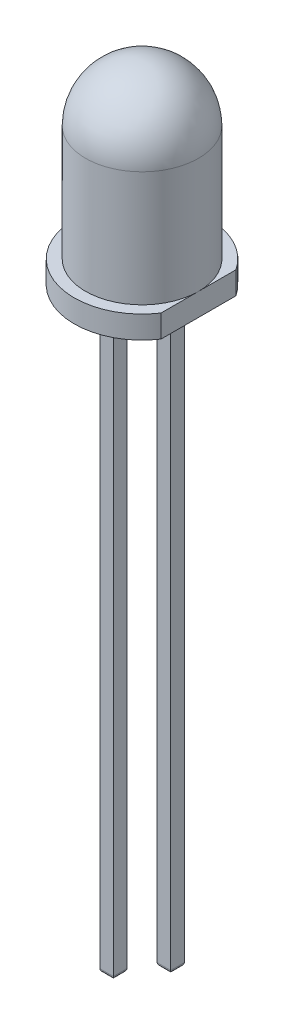
ISO-10303-21;
HEADER;
FILE_DESCRIPTION(('STEP AP214'),'2;1');
FILE_NAME('part.step','',(''),(''),'','','');
FILE_SCHEMA(('AUTOMOTIVE_DESIGN { 1 0 10303 214 1 1 1 1 }'));
ENDSEC;
DATA;
#1=APPLICATION_CONTEXT('core data for automotive mechanical design processes');
#2=APPLICATION_PROTOCOL_DEFINITION('international standard','automotive_design',2000,#1);
#3=PRODUCT_CONTEXT('',#1,'mechanical');
#4=PRODUCT('Part','Part','',(#3));
#5=PRODUCT_RELATED_PRODUCT_CATEGORY('part','',(#4));
#6=PRODUCT_DEFINITION_FORMATION('','',#4);
#7=PRODUCT_DEFINITION_CONTEXT('part definition',#1,'design');
#8=PRODUCT_DEFINITION('design','',#6,#7);
#9=PRODUCT_DEFINITION_SHAPE('','',#8);
#10=(LENGTH_UNIT() NAMED_UNIT(*) SI_UNIT(.MILLI.,.METRE.));
#11=(NAMED_UNIT(*) PLANE_ANGLE_UNIT() SI_UNIT($,.RADIAN.));
#12=(NAMED_UNIT(*) SI_UNIT($,.STERADIAN.) SOLID_ANGLE_UNIT());
#13=UNCERTAINTY_MEASURE_WITH_UNIT(LENGTH_MEASURE(1.E-05),#10,'distance_accuracy_value','');
#14=(GEOMETRIC_REPRESENTATION_CONTEXT(3) GLOBAL_UNCERTAINTY_ASSIGNED_CONTEXT((#13)) GLOBAL_UNIT_ASSIGNED_CONTEXT((#10,
#11,#12)) REPRESENTATION_CONTEXT('',''));
#15=CARTESIAN_POINT('',(0.,0.,0.));
#16=DIRECTION('',(0.,0.,1.));
#17=DIRECTION('',(1.,0.,0.));
#18=AXIS2_PLACEMENT_3D('',#15,#16,#17);
#19=CARTESIAN_POINT('',(0.,-4.3,0.));
#20=DIRECTION('',(0.,1.,0.));
#21=DIRECTION('',(0.,0.,1.));
#22=AXIS2_PLACEMENT_3D('',#19,#20,#21);
#23=PLANE('',#22);
#24=DIRECTION('',(0.,0.,-1.));
#25=VECTOR('',#24,1.);
#26=CARTESIAN_POINT('',(1.72,-4.3,0.));
#27=LINE('',#26,#25);
#28=CARTESIAN_POINT('',(1.72,-4.3,0.45));
#29=VERTEX_POINT('',#28);
#30=CARTESIAN_POINT('',(1.72,-4.3,-0.45));
#31=VERTEX_POINT('',#30);
#32=EDGE_CURVE('E235',#29,#31,#27,.T.);
#33=ORIENTED_EDGE('',*,*,#32,.T.);
#34=DIRECTION('',(1.,0.,0.));
#35=VECTOR('',#34,1.);
#36=CARTESIAN_POINT('',(0.97,-4.3,-0.45));
#37=LINE('',#36,#35);
#38=CARTESIAN_POINT('',(0.82,-4.3,-0.45));
#39=VERTEX_POINT('',#38);
#40=EDGE_CURVE('E237',#31,#39,#37,.F.);
#41=ORIENTED_EDGE('',*,*,#40,.T.);
#42=DIRECTION('',(0.,0.,-1.));
#43=VECTOR('',#42,1.);
#44=CARTESIAN_POINT('',(0.82,-4.3,0.3));
#45=LINE('',#44,#43);
#46=CARTESIAN_POINT('',(0.82,-4.3,0.45));
#47=VERTEX_POINT('',#46);
#48=EDGE_CURVE('E233',#39,#47,#45,.F.);
#49=ORIENTED_EDGE('',*,*,#48,.T.);
#50=DIRECTION('',(1.,0.,0.));
#51=VECTOR('',#50,1.);
#52=CARTESIAN_POINT('',(0.,-4.3,0.45));
#53=LINE('',#52,#51);
#54=EDGE_CURVE('E231',#47,#29,#53,.T.);
#55=ORIENTED_EDGE('',*,*,#54,.T.);
#56=EDGE_LOOP('',(#33,#41,#49,#55));
#57=FACE_BOUND('',#56,.T.);
#58=DIRECTION('',(-1.,0.,0.));
#59=VECTOR('',#58,1.);
#60=CARTESIAN_POINT('',(0.,-4.3,-0.45));
#61=LINE('',#60,#59);
#62=CARTESIAN_POINT('',(-0.82,-4.3,-0.45));
#63=VERTEX_POINT('',#62);
#64=CARTESIAN_POINT('',(-1.72,-4.3,-0.45));
#65=VERTEX_POINT('',#64);
#66=EDGE_CURVE('E198',#63,#65,#61,.T.);
#67=ORIENTED_EDGE('',*,*,#66,.T.);
#68=DIRECTION('',(0.,0.,1.));
#69=VECTOR('',#68,1.);
#70=CARTESIAN_POINT('',(-1.72,-4.3,0.));
#71=LINE('',#70,#69);
#72=CARTESIAN_POINT('',(-1.72,-4.3,0.45));
#73=VERTEX_POINT('',#72);
#74=EDGE_CURVE('E200',#65,#73,#71,.T.);
#75=ORIENTED_EDGE('',*,*,#74,.T.);
#76=DIRECTION('',(-1.,0.,0.));
#77=VECTOR('',#76,1.);
#78=CARTESIAN_POINT('',(-0.97,-4.3,0.45));
#79=LINE('',#78,#77);
#80=CARTESIAN_POINT('',(-0.82,-4.3,0.45));
#81=VERTEX_POINT('',#80);
#82=EDGE_CURVE('E194',#73,#81,#79,.F.);
#83=ORIENTED_EDGE('',*,*,#82,.T.);
#84=DIRECTION('',(0.,0.,1.));
#85=VECTOR('',#84,1.);
#86=CARTESIAN_POINT('',(-0.82,-4.3,-0.3));
#87=LINE('',#86,#85);
#88=EDGE_CURVE('E196',#81,#63,#87,.F.);
#89=ORIENTED_EDGE('',*,*,#88,.T.);
#90=EDGE_LOOP('',(#67,#75,#83,#89));
#91=FACE_BOUND('',#90,.T.);
#92=CARTESIAN_POINT('',(0.,-4.3,0.));
#93=DIRECTION('',(0.,-1.,0.));
#94=DIRECTION('',(0.,0.,-1.));
#95=AXIS2_PLACEMENT_3D('',#92,#93,#94);
#96=CIRCLE('',#95,3.);
#97=CARTESIAN_POINT('',(2.5,-4.3,1.6583123951777));
#98=VERTEX_POINT('',#97);
#99=CARTESIAN_POINT('',(2.5,-4.3,-1.6583123951777));
#100=VERTEX_POINT('',#99);
#101=EDGE_CURVE('E171',#98,#100,#96,.T.);
#102=ORIENTED_EDGE('',*,*,#101,.T.);
#103=DIRECTION('',(0.,0.,1.));
#104=VECTOR('',#103,1.);
#105=CARTESIAN_POINT('',(2.5,-4.3,0.));
#106=LINE('',#105,#104);
#107=EDGE_CURVE('E166',#100,#98,#106,.T.);
#108=ORIENTED_EDGE('',*,*,#107,.T.);
#109=EDGE_LOOP('',(#102,#108));
#110=FACE_BOUND('',#109,.T.);
#111=ADVANCED_FACE('F32',(#57,#91,#110),#23,.F.);
#112=CARTESIAN_POINT('',(0.,4.3,0.));
#113=DIRECTION('',(0.,-1.,0.));
#114=DIRECTION('',(0.,0.,-1.));
#115=AXIS2_PLACEMENT_3D('',#112,#113,#114);
#116=CYLINDRICAL_SURFACE('',#115,2.5);
#117=CARTESIAN_POINT('',(0.,1.8,0.));
#118=DIRECTION('',(0.,-1.,0.));
#119=DIRECTION('',(0.,0.,-1.));
#120=AXIS2_PLACEMENT_3D('',#117,#118,#119);
#121=CIRCLE('',#120,2.5);
#122=CARTESIAN_POINT('',(0.,1.8,-2.5));
#123=VERTEX_POINT('',#122);
#124=EDGE_CURVE('E186',#123,#123,#121,.T.);
#125=ORIENTED_EDGE('',*,*,#124,.T.);
#126=EDGE_LOOP('',(#125));
#127=FACE_BOUND('',#126,.T.);
#128=CARTESIAN_POINT('',(0.,-3.3,0.));
#129=DIRECTION('',(0.,-1.,0.));
#130=DIRECTION('',(0.,0.,-1.));
#131=AXIS2_PLACEMENT_3D('',#128,#129,#130);
#132=CIRCLE('',#131,2.5);
#133=CARTESIAN_POINT('',(2.5,-3.3,0.));
#134=VERTEX_POINT('',#133);
#135=EDGE_CURVE('E180',#134,#134,#132,.T.);
#136=ORIENTED_EDGE('',*,*,#135,.F.);
#137=EDGE_LOOP('',(#136));
#138=FACE_BOUND('',#137,.T.);
#139=ADVANCED_FACE('F349',(#127,#138),#116,.T.);
#140=CARTESIAN_POINT('',(0.,-3.3,0.));
#141=DIRECTION('',(0.,-1.,0.));
#142=DIRECTION('',(0.,0.,-1.));
#143=AXIS2_PLACEMENT_3D('',#140,#141,#142);
#144=PLANE('',#143);
#145=CARTESIAN_POINT('',(0.,-3.3,0.));
#146=DIRECTION('',(0.,-1.,0.));
#147=DIRECTION('',(0.,0.,-1.));
#148=AXIS2_PLACEMENT_3D('',#145,#146,#147);
#149=CIRCLE('',#148,3.);
#150=CARTESIAN_POINT('',(2.5,-3.3,1.6583123951777));
#151=VERTEX_POINT('',#150);
#152=CARTESIAN_POINT('',(2.5,-3.3,-1.6583123951777));
#153=VERTEX_POINT('',#152);
#154=EDGE_CURVE('E178',#151,#153,#149,.T.);
#155=ORIENTED_EDGE('',*,*,#154,.F.);
#156=DIRECTION('',(0.,0.,1.));
#157=VECTOR('',#156,1.);
#158=CARTESIAN_POINT('',(2.5,-3.3,-3.));
#159=LINE('',#158,#157);
#160=EDGE_CURVE('E181',#134,#151,#159,.T.);
#161=ORIENTED_EDGE('',*,*,#160,.F.);
#162=ORIENTED_EDGE('',*,*,#135,.T.);
#163=EDGE_CURVE('E163',#153,#134,#159,.T.);
#164=ORIENTED_EDGE('',*,*,#163,.F.);
#165=EDGE_LOOP('',(#155,#161,#162,#164));
#166=FACE_BOUND('',#165,.T.);
#167=ADVANCED_FACE('F177',(#166),#144,.F.);
#168=CARTESIAN_POINT('',(0.,-3.3,0.));
#169=DIRECTION('',(0.,-1.,0.));
#170=DIRECTION('',(0.,0.,-1.));
#171=AXIS2_PLACEMENT_3D('',#168,#169,#170);
#172=CYLINDRICAL_SURFACE('',#171,3.);
#173=DIRECTION('',(0.,-1.,0.));
#174=VECTOR('',#173,1.);
#175=CARTESIAN_POINT('',(2.5,-3.3,-1.6583123951777));
#176=LINE('',#175,#174);
#177=EDGE_CURVE('E160',#100,#153,#176,.F.);
#178=ORIENTED_EDGE('',*,*,#177,.F.);
#179=ORIENTED_EDGE('',*,*,#101,.F.);
#180=DIRECTION('',(0.,-1.,0.));
#181=VECTOR('',#180,1.);
#182=CARTESIAN_POINT('',(2.5,-3.3,1.6583123951777));
#183=LINE('',#182,#181);
#184=EDGE_CURVE('E172',#151,#98,#183,.T.);
#185=ORIENTED_EDGE('',*,*,#184,.F.);
#186=ORIENTED_EDGE('',*,*,#154,.T.);
#187=EDGE_LOOP('',(#178,#179,#185,#186));
#188=FACE_BOUND('',#187,.T.);
#189=ADVANCED_FACE('F184',(#188),#172,.T.);
#190=CARTESIAN_POINT('',(0.,1.8,0.));
#191=DIRECTION('',(0.,0.,1.));
#192=DIRECTION('',(1.,0.,0.));
#193=AXIS2_PLACEMENT_3D('',#190,#191,#192);
#194=SPHERICAL_SURFACE('',#193,2.5);
#195=CARTESIAN_POINT('',(0.,1.8,0.));
#196=DIRECTION('',(0.,-1.,0.));
#197=DIRECTION('',(0.,0.,-1.));
#198=AXIS2_PLACEMENT_3D('',#195,#196,#197);
#199=SPHERICAL_SURFACE('',#198,2.5);
#200=ORIENTED_EDGE('',*,*,#124,.F.);
#201=EDGE_LOOP('',(#200));
#202=FACE_BOUND('',#201,.T.);
#203=ADVANCED_FACE('F361',(#202),#199,.T.);
#204=CARTESIAN_POINT('',(2.5,-3.3,-3.));
#205=DIRECTION('',(-1.,0.,0.));
#206=DIRECTION('',(0.,0.,1.));
#207=AXIS2_PLACEMENT_3D('',#204,#205,#206);
#208=PLANE('',#207);
#209=ORIENTED_EDGE('',*,*,#177,.T.);
#210=ORIENTED_EDGE('',*,*,#163,.T.);
#211=ORIENTED_EDGE('',*,*,#160,.T.);
#212=ORIENTED_EDGE('',*,*,#184,.T.);
#213=ORIENTED_EDGE('',*,*,#107,.F.);
#214=EDGE_LOOP('',(#209,#210,#211,#212,#213));
#215=FACE_BOUND('',#214,.T.);
#216=ADVANCED_FACE('F162',(#215),#208,.F.);
#217=CARTESIAN_POINT('',(-0.97,-31.3,-0.3));
#218=DIRECTION('',(0.,0.,-1.));
#219=DIRECTION('',(-1.,0.,0.));
#220=AXIS2_PLACEMENT_3D('',#217,#218,#219);
#221=PLANE('',#220);
#222=DIRECTION('',(0.,1.,0.));
#223=VECTOR('',#222,1.);
#224=CARTESIAN_POINT('',(-0.97,-31.3,-0.3));
#225=LINE('',#224,#223);
#226=CARTESIAN_POINT('',(-0.97,-31.15,-0.3));
#227=VERTEX_POINT('',#226);
#228=CARTESIAN_POINT('',(-0.97,-4.45,-0.3));
#229=VERTEX_POINT('',#228);
#230=EDGE_CURVE('E341',#227,#229,#225,.T.);
#231=ORIENTED_EDGE('',*,*,#230,.F.);
#232=DIRECTION('',(-1.,0.,0.));
#233=VECTOR('',#232,1.);
#234=CARTESIAN_POINT('',(-1.57,-31.15,-0.3));
#235=LINE('',#234,#233);
#236=CARTESIAN_POINT('',(-1.57,-31.15,-0.3));
#237=VERTEX_POINT('',#236);
#238=EDGE_CURVE('E276',#227,#237,#235,.T.);
#239=ORIENTED_EDGE('',*,*,#238,.T.);
#240=DIRECTION('',(0.,1.,0.));
#241=VECTOR('',#240,1.);
#242=CARTESIAN_POINT('',(-1.57,-31.3,-0.3));
#243=LINE('',#242,#241);
#244=CARTESIAN_POINT('',(-1.57,-4.45,-0.3));
#245=VERTEX_POINT('',#244);
#246=EDGE_CURVE('E340',#237,#245,#243,.T.);
#247=ORIENTED_EDGE('',*,*,#246,.T.);
#248=DIRECTION('',(-1.,0.,0.));
#249=VECTOR('',#248,1.);
#250=CARTESIAN_POINT('',(-0.97,-4.45,-0.3));
#251=LINE('',#250,#249);
#252=EDGE_CURVE('E206',#245,#229,#251,.F.);
#253=ORIENTED_EDGE('',*,*,#252,.T.);
#254=EDGE_LOOP('',(#231,#239,#247,#253));
#255=FACE_BOUND('',#254,.T.);
#256=ADVANCED_FACE('F536',(#255),#221,.T.);
#257=CARTESIAN_POINT('',(-0.97,-31.3,-0.3));
#258=DIRECTION('',(-1.,0.,0.));
#259=DIRECTION('',(0.,0.,1.));
#260=AXIS2_PLACEMENT_3D('',#257,#258,#259);
#261=PLANE('',#260);
#262=DIRECTION('',(0.,1.,0.));
#263=VECTOR('',#262,1.);
#264=CARTESIAN_POINT('',(-0.97,-31.3,0.3));
#265=LINE('',#264,#263);
#266=CARTESIAN_POINT('',(-0.97,-31.15,0.3));
#267=VERTEX_POINT('',#266);
#268=CARTESIAN_POINT('',(-0.97,-4.45,0.3));
#269=VERTEX_POINT('',#268);
#270=EDGE_CURVE('E343',#267,#269,#265,.T.);
#271=ORIENTED_EDGE('',*,*,#270,.F.);
#272=DIRECTION('',(0.,0.,1.));
#273=VECTOR('',#272,1.);
#274=CARTESIAN_POINT('',(-0.97,-31.15,-0.3));
#275=LINE('',#274,#273);
#276=EDGE_CURVE('E274',#267,#227,#275,.F.);
#277=ORIENTED_EDGE('',*,*,#276,.T.);
#278=ORIENTED_EDGE('',*,*,#230,.T.);
#279=DIRECTION('',(0.,0.,1.));
#280=VECTOR('',#279,1.);
#281=CARTESIAN_POINT('',(-0.97,-4.45,0.3));
#282=LINE('',#281,#280);
#283=EDGE_CURVE('E209',#229,#269,#282,.T.);
#284=ORIENTED_EDGE('',*,*,#283,.T.);
#285=EDGE_LOOP('',(#271,#277,#278,#284));
#286=FACE_BOUND('',#285,.T.);
#287=ADVANCED_FACE('F528',(#286),#261,.F.);
#288=CARTESIAN_POINT('',(-0.97,-31.3,0.3));
#289=DIRECTION('',(0.,0.,-1.));
#290=DIRECTION('',(-1.,0.,0.));
#291=AXIS2_PLACEMENT_3D('',#288,#289,#290);
#292=PLANE('',#291);
#293=DIRECTION('',(0.,1.,0.));
#294=VECTOR('',#293,1.);
#295=CARTESIAN_POINT('',(-1.57,-31.3,0.3));
#296=LINE('',#295,#294);
#297=CARTESIAN_POINT('',(-1.57,-31.15,0.3));
#298=VERTEX_POINT('',#297);
#299=CARTESIAN_POINT('',(-1.57,-4.45,0.3));
#300=VERTEX_POINT('',#299);
#301=EDGE_CURVE('E345',#298,#300,#296,.T.);
#302=ORIENTED_EDGE('',*,*,#301,.F.);
#303=DIRECTION('',(-1.,0.,0.));
#304=VECTOR('',#303,1.);
#305=CARTESIAN_POINT('',(-0.97,-31.15,0.3));
#306=LINE('',#305,#304);
#307=EDGE_CURVE('E272',#298,#267,#306,.F.);
#308=ORIENTED_EDGE('',*,*,#307,.T.);
#309=ORIENTED_EDGE('',*,*,#270,.T.);
#310=DIRECTION('',(-1.,0.,0.));
#311=VECTOR('',#310,1.);
#312=CARTESIAN_POINT('',(-1.57,-4.45,0.3));
#313=LINE('',#312,#311);
#314=EDGE_CURVE('E212',#269,#300,#313,.T.);
#315=ORIENTED_EDGE('',*,*,#314,.T.);
#316=EDGE_LOOP('',(#302,#308,#309,#315));
#317=FACE_BOUND('',#316,.T.);
#318=ADVANCED_FACE('F520',(#317),#292,.F.);
#319=CARTESIAN_POINT('',(-1.57,-31.3,-0.3));
#320=DIRECTION('',(-1.,0.,0.));
#321=DIRECTION('',(0.,0.,1.));
#322=AXIS2_PLACEMENT_3D('',#319,#320,#321);
#323=PLANE('',#322);
#324=ORIENTED_EDGE('',*,*,#246,.F.);
#325=DIRECTION('',(0.,0.,1.));
#326=VECTOR('',#325,1.);
#327=CARTESIAN_POINT('',(-1.57,-31.15,0.3));
#328=LINE('',#327,#326);
#329=EDGE_CURVE('E249',#237,#298,#328,.T.);
#330=ORIENTED_EDGE('',*,*,#329,.T.);
#331=ORIENTED_EDGE('',*,*,#301,.T.);
#332=DIRECTION('',(0.,0.,1.));
#333=VECTOR('',#332,1.);
#334=CARTESIAN_POINT('',(-1.57,-4.45,-0.3));
#335=LINE('',#334,#333);
#336=EDGE_CURVE('E203',#300,#245,#335,.F.);
#337=ORIENTED_EDGE('',*,*,#336,.T.);
#338=EDGE_LOOP('',(#324,#330,#331,#337));
#339=FACE_BOUND('',#338,.T.);
#340=ADVANCED_FACE('F512',(#339),#323,.T.);
#341=CARTESIAN_POINT('',(0.,-31.3,0.));
#342=DIRECTION('',(0.,1.,0.));
#343=DIRECTION('',(0.,0.,1.));
#344=AXIS2_PLACEMENT_3D('',#341,#342,#343);
#345=PLANE('',#344);
#346=DIRECTION('',(-1.,0.,0.));
#347=VECTOR('',#346,1.);
#348=CARTESIAN_POINT('',(0.,-31.3,0.15));
#349=LINE('',#348,#347);
#350=CARTESIAN_POINT('',(-1.12,-31.3,0.15));
#351=VERTEX_POINT('',#350);
#352=CARTESIAN_POINT('',(-1.42,-31.3,0.15));
#353=VERTEX_POINT('',#352);
#354=EDGE_CURVE('E267',#351,#353,#349,.T.);
#355=ORIENTED_EDGE('',*,*,#354,.T.);
#356=DIRECTION('',(0.,0.,1.));
#357=VECTOR('',#356,1.);
#358=CARTESIAN_POINT('',(-1.42,-31.3,-0.3));
#359=LINE('',#358,#357);
#360=CARTESIAN_POINT('',(-1.42,-31.3,-0.15));
#361=VERTEX_POINT('',#360);
#362=EDGE_CURVE('E269',#353,#361,#359,.F.);
#363=ORIENTED_EDGE('',*,*,#362,.T.);
#364=DIRECTION('',(-1.,0.,0.));
#365=VECTOR('',#364,1.);
#366=CARTESIAN_POINT('',(-0.97,-31.3,-0.15));
#367=LINE('',#366,#365);
#368=CARTESIAN_POINT('',(-1.12,-31.3,-0.15));
#369=VERTEX_POINT('',#368);
#370=EDGE_CURVE('E263',#361,#369,#367,.F.);
#371=ORIENTED_EDGE('',*,*,#370,.T.);
#372=DIRECTION('',(0.,0.,1.));
#373=VECTOR('',#372,1.);
#374=CARTESIAN_POINT('',(-1.12,-31.3,0.));
#375=LINE('',#374,#373);
#376=EDGE_CURVE('E265',#369,#351,#375,.T.);
#377=ORIENTED_EDGE('',*,*,#376,.T.);
#378=EDGE_LOOP('',(#355,#363,#371,#377));
#379=FACE_BOUND('',#378,.T.);
#380=ADVANCED_FACE('F505',(#379),#345,.F.);
#381=CARTESIAN_POINT('',(0.97,-29.8,0.3));
#382=DIRECTION('',(1.,0.,0.));
#383=DIRECTION('',(0.,0.,-1.));
#384=AXIS2_PLACEMENT_3D('',#381,#382,#383);
#385=PLANE('',#384);
#386=DIRECTION('',(0.,1.,0.));
#387=VECTOR('',#386,1.);
#388=CARTESIAN_POINT('',(0.97,-29.8,-0.3));
#389=LINE('',#388,#387);
#390=CARTESIAN_POINT('',(0.97,-29.65,-0.3));
#391=VERTEX_POINT('',#390);
#392=CARTESIAN_POINT('',(0.97,-4.45,-0.3));
#393=VERTEX_POINT('',#392);
#394=EDGE_CURVE('E335',#391,#393,#389,.T.);
#395=ORIENTED_EDGE('',*,*,#394,.F.);
#396=DIRECTION('',(0.,0.,-1.));
#397=VECTOR('',#396,1.);
#398=CARTESIAN_POINT('',(0.97,-29.65,0.3));
#399=LINE('',#398,#397);
#400=CARTESIAN_POINT('',(0.97,-29.65,0.3));
#401=VERTEX_POINT('',#400);
#402=EDGE_CURVE('E11',#391,#401,#399,.F.);
#403=ORIENTED_EDGE('',*,*,#402,.T.);
#404=DIRECTION('',(0.,1.,0.));
#405=VECTOR('',#404,1.);
#406=CARTESIAN_POINT('',(0.97,-29.8,0.3));
#407=LINE('',#406,#405);
#408=CARTESIAN_POINT('',(0.97,-4.45,0.3));
#409=VERTEX_POINT('',#408);
#410=EDGE_CURVE('E228',#401,#409,#407,.T.);
#411=ORIENTED_EDGE('',*,*,#410,.T.);
#412=DIRECTION('',(0.,0.,-1.));
#413=VECTOR('',#412,1.);
#414=CARTESIAN_POINT('',(0.97,-4.45,-0.3));
#415=LINE('',#414,#413);
#416=EDGE_CURVE('E243',#409,#393,#415,.T.);
#417=ORIENTED_EDGE('',*,*,#416,.T.);
#418=EDGE_LOOP('',(#395,#403,#411,#417));
#419=FACE_BOUND('',#418,.T.);
#420=ADVANCED_FACE('F499',(#419),#385,.F.);
#421=CARTESIAN_POINT('',(0.97,-29.8,-0.3));
#422=DIRECTION('',(0.,0.,1.));
#423=DIRECTION('',(1.,0.,0.));
#424=AXIS2_PLACEMENT_3D('',#421,#422,#423);
#425=PLANE('',#424);
#426=DIRECTION('',(0.,1.,0.));
#427=VECTOR('',#426,1.);
#428=CARTESIAN_POINT('',(1.57,-29.8,-0.3));
#429=LINE('',#428,#427);
#430=CARTESIAN_POINT('',(1.57,-29.65,-0.3));
#431=VERTEX_POINT('',#430);
#432=CARTESIAN_POINT('',(1.57,-4.45,-0.3));
#433=VERTEX_POINT('',#432);
#434=EDGE_CURVE('E333',#431,#433,#429,.T.);
#435=ORIENTED_EDGE('',*,*,#434,.F.);
#436=DIRECTION('',(1.,0.,0.));
#437=VECTOR('',#436,1.);
#438=CARTESIAN_POINT('',(0.97,-29.65,-0.3));
#439=LINE('',#438,#437);
#440=EDGE_CURVE('E41',#431,#391,#439,.F.);
#441=ORIENTED_EDGE('',*,*,#440,.T.);
#442=ORIENTED_EDGE('',*,*,#394,.T.);
#443=DIRECTION('',(1.,0.,0.));
#444=VECTOR('',#443,1.);
#445=CARTESIAN_POINT('',(1.57,-4.45,-0.3));
#446=LINE('',#445,#444);
#447=EDGE_CURVE('E215',#393,#433,#446,.T.);
#448=ORIENTED_EDGE('',*,*,#447,.T.);
#449=EDGE_LOOP('',(#435,#441,#442,#448));
#450=FACE_BOUND('',#449,.T.);
#451=ADVANCED_FACE('F492',(#450),#425,.F.);
#452=CARTESIAN_POINT('',(1.57,-29.8,0.3));
#453=DIRECTION('',(1.,0.,0.));
#454=DIRECTION('',(0.,0.,-1.));
#455=AXIS2_PLACEMENT_3D('',#452,#453,#454);
#456=PLANE('',#455);
#457=DIRECTION('',(0.,1.,0.));
#458=VECTOR('',#457,1.);
#459=CARTESIAN_POINT('',(1.57,-29.8,0.3));
#460=LINE('',#459,#458);
#461=CARTESIAN_POINT('',(1.57,-29.65,0.3));
#462=VERTEX_POINT('',#461);
#463=CARTESIAN_POINT('',(1.57,-4.45,0.3));
#464=VERTEX_POINT('',#463);
#465=EDGE_CURVE('E329',#462,#464,#460,.T.);
#466=ORIENTED_EDGE('',*,*,#465,.F.);
#467=DIRECTION('',(0.,0.,-1.));
#468=VECTOR('',#467,1.);
#469=CARTESIAN_POINT('',(1.57,-29.65,0.3));
#470=LINE('',#469,#468);
#471=EDGE_CURVE('E56',#462,#431,#470,.T.);
#472=ORIENTED_EDGE('',*,*,#471,.T.);
#473=ORIENTED_EDGE('',*,*,#434,.T.);
#474=DIRECTION('',(0.,0.,-1.));
#475=VECTOR('',#474,1.);
#476=CARTESIAN_POINT('',(1.57,-4.45,0.3));
#477=LINE('',#476,#475);
#478=EDGE_CURVE('E240',#433,#464,#477,.F.);
#479=ORIENTED_EDGE('',*,*,#478,.T.);
#480=EDGE_LOOP('',(#466,#472,#473,#479));
#481=FACE_BOUND('',#480,.T.);
#482=ADVANCED_FACE('F330',(#481),#456,.T.);
#483=CARTESIAN_POINT('',(0.97,-29.8,0.3));
#484=DIRECTION('',(0.,0.,1.));
#485=DIRECTION('',(1.,0.,0.));
#486=AXIS2_PLACEMENT_3D('',#483,#484,#485);
#487=PLANE('',#486);
#488=ORIENTED_EDGE('',*,*,#410,.F.);
#489=DIRECTION('',(1.,0.,0.));
#490=VECTOR('',#489,1.);
#491=CARTESIAN_POINT('',(0.97,-29.65,0.3));
#492=LINE('',#491,#490);
#493=EDGE_CURVE('E278',#401,#462,#492,.T.);
#494=ORIENTED_EDGE('',*,*,#493,.T.);
#495=ORIENTED_EDGE('',*,*,#465,.T.);
#496=DIRECTION('',(1.,0.,0.));
#497=VECTOR('',#496,1.);
#498=CARTESIAN_POINT('',(0.97,-4.45,0.3));
#499=LINE('',#498,#497);
#500=EDGE_CURVE('E246',#464,#409,#499,.F.);
#501=ORIENTED_EDGE('',*,*,#500,.T.);
#502=EDGE_LOOP('',(#488,#494,#495,#501));
#503=FACE_BOUND('',#502,.T.);
#504=ADVANCED_FACE('F328',(#503),#487,.T.);
#505=CARTESIAN_POINT('',(0.,-29.8,0.));
#506=DIRECTION('',(0.,-1.,0.));
#507=DIRECTION('',(0.,0.,-1.));
#508=AXIS2_PLACEMENT_3D('',#505,#506,#507);
#509=PLANE('',#508);
#510=DIRECTION('',(0.,0.,-1.));
#511=VECTOR('',#510,1.);
#512=CARTESIAN_POINT('',(1.42,-29.8,0.));
#513=LINE('',#512,#511);
#514=CARTESIAN_POINT('',(1.42,-29.8,-0.15));
#515=VERTEX_POINT('',#514);
#516=CARTESIAN_POINT('',(1.42,-29.8,0.15));
#517=VERTEX_POINT('',#516);
#518=EDGE_CURVE('E294',#515,#517,#513,.F.);
#519=ORIENTED_EDGE('',*,*,#518,.T.);
#520=DIRECTION('',(1.,0.,0.));
#521=VECTOR('',#520,1.);
#522=CARTESIAN_POINT('',(0.,-29.8,0.15));
#523=LINE('',#522,#521);
#524=CARTESIAN_POINT('',(1.12,-29.8,0.15));
#525=VERTEX_POINT('',#524);
#526=EDGE_CURVE('E296',#517,#525,#523,.F.);
#527=ORIENTED_EDGE('',*,*,#526,.T.);
#528=DIRECTION('',(0.,0.,-1.));
#529=VECTOR('',#528,1.);
#530=CARTESIAN_POINT('',(1.12,-29.8,-0.3));
#531=LINE('',#530,#529);
#532=CARTESIAN_POINT('',(1.12,-29.8,-0.15));
#533=VERTEX_POINT('',#532);
#534=EDGE_CURVE('E290',#525,#533,#531,.T.);
#535=ORIENTED_EDGE('',*,*,#534,.T.);
#536=DIRECTION('',(1.,0.,0.));
#537=VECTOR('',#536,1.);
#538=CARTESIAN_POINT('',(1.57,-29.8,-0.15));
#539=LINE('',#538,#537);
#540=EDGE_CURVE('E292',#533,#515,#539,.T.);
#541=ORIENTED_EDGE('',*,*,#540,.T.);
#542=EDGE_LOOP('',(#519,#527,#535,#541));
#543=FACE_BOUND('',#542,.T.);
#544=ADVANCED_FACE('F319',(#543),#509,.T.);
#545=CARTESIAN_POINT('',(-0.82,-4.45,-0.3));
#546=DIRECTION('',(0.,0.,-1.));
#547=DIRECTION('',(-1.,0.,0.));
#548=AXIS2_PLACEMENT_3D('',#545,#546,#547);
#549=CYLINDRICAL_SURFACE('',#548,0.15);
#550=CARTESIAN_POINT('',(-0.82,-4.45,0.45));
#551=DIRECTION('',(0.707106781186548,0.,-0.707106781186547));
#552=DIRECTION('',(0.707106781186547,0.,0.707106781186548));
#553=AXIS2_PLACEMENT_3D('',#550,#551,#552);
#554=ELLIPSE('',#553,0.212132034355964,0.15);
#555=EDGE_CURVE('E222',#269,#81,#554,.T.);
#556=ORIENTED_EDGE('',*,*,#555,.F.);
#557=ORIENTED_EDGE('',*,*,#283,.F.);
#558=CARTESIAN_POINT('',(-0.82,-4.45,-0.45));
#559=DIRECTION('',(-0.707106781186547,0.,-0.707106781186548));
#560=DIRECTION('',(0.707106781186548,0.,-0.707106781186547));
#561=AXIS2_PLACEMENT_3D('',#558,#559,#560);
#562=ELLIPSE('',#561,0.212132034355964,0.15);
#563=EDGE_CURVE('E225',#63,#229,#562,.F.);
#564=ORIENTED_EDGE('',*,*,#563,.F.);
#565=ORIENTED_EDGE('',*,*,#88,.F.);
#566=EDGE_LOOP('',(#556,#557,#564,#565));
#567=FACE_BOUND('',#566,.T.);
#568=ADVANCED_FACE('F377',(#567),#549,.F.);
#569=CARTESIAN_POINT('',(0.,-4.45,-0.45));
#570=DIRECTION('',(-1.,0.,0.));
#571=DIRECTION('',(0.,0.,1.));
#572=AXIS2_PLACEMENT_3D('',#569,#570,#571);
#573=CYLINDRICAL_SURFACE('',#572,0.15);
#574=ORIENTED_EDGE('',*,*,#563,.T.);
#575=ORIENTED_EDGE('',*,*,#252,.F.);
#576=CARTESIAN_POINT('',(-1.72,-4.45,-0.45));
#577=DIRECTION('',(-0.707106781186548,0.,0.707106781186547));
#578=DIRECTION('',(-0.707106781186547,0.,-0.707106781186548));
#579=AXIS2_PLACEMENT_3D('',#576,#577,#578);
#580=ELLIPSE('',#579,0.212132034355964,0.15);
#581=EDGE_CURVE('E218',#65,#245,#580,.F.);
#582=ORIENTED_EDGE('',*,*,#581,.F.);
#583=ORIENTED_EDGE('',*,*,#66,.F.);
#584=EDGE_LOOP('',(#574,#575,#582,#583));
#585=FACE_BOUND('',#584,.T.);
#586=ADVANCED_FACE('F373',(#585),#573,.F.);
#587=CARTESIAN_POINT('',(-0.97,-4.45,0.45));
#588=DIRECTION('',(1.,0.,0.));
#589=DIRECTION('',(0.,0.,-1.));
#590=AXIS2_PLACEMENT_3D('',#587,#588,#589);
#591=CYLINDRICAL_SURFACE('',#590,0.15);
#592=ORIENTED_EDGE('',*,*,#555,.T.);
#593=ORIENTED_EDGE('',*,*,#82,.F.);
#594=CARTESIAN_POINT('',(-1.72,-4.45,0.45));
#595=DIRECTION('',(0.707106781186547,0.,0.707106781186548));
#596=DIRECTION('',(0.707106781186548,0.,-0.707106781186547));
#597=AXIS2_PLACEMENT_3D('',#594,#595,#596);
#598=ELLIPSE('',#597,0.212132034355964,0.15);
#599=EDGE_CURVE('E216',#300,#73,#598,.T.);
#600=ORIENTED_EDGE('',*,*,#599,.F.);
#601=ORIENTED_EDGE('',*,*,#314,.F.);
#602=EDGE_LOOP('',(#592,#593,#600,#601));
#603=FACE_BOUND('',#602,.T.);
#604=ADVANCED_FACE('F369',(#603),#591,.F.);
#605=CARTESIAN_POINT('',(-1.72,-4.45,0.));
#606=DIRECTION('',(0.,0.,1.));
#607=DIRECTION('',(1.,0.,0.));
#608=AXIS2_PLACEMENT_3D('',#605,#606,#607);
#609=CYLINDRICAL_SURFACE('',#608,0.15);
#610=ORIENTED_EDGE('',*,*,#581,.T.);
#611=ORIENTED_EDGE('',*,*,#336,.F.);
#612=ORIENTED_EDGE('',*,*,#599,.T.);
#613=ORIENTED_EDGE('',*,*,#74,.F.);
#614=EDGE_LOOP('',(#610,#611,#612,#613));
#615=FACE_BOUND('',#614,.T.);
#616=ADVANCED_FACE('F365',(#615),#609,.F.);
#617=CARTESIAN_POINT('',(0.,-4.45,0.45));
#618=DIRECTION('',(1.,0.,0.));
#619=DIRECTION('',(0.,0.,-1.));
#620=AXIS2_PLACEMENT_3D('',#617,#618,#619);
#621=CYLINDRICAL_SURFACE('',#620,0.15);
#622=CARTESIAN_POINT('',(1.72,-4.45,0.45));
#623=DIRECTION('',(0.707106781186548,0.,-0.707106781186547));
#624=DIRECTION('',(0.707106781186547,0.,0.707106781186548));
#625=AXIS2_PLACEMENT_3D('',#622,#623,#624);
#626=ELLIPSE('',#625,0.212132034355964,0.15);
#627=EDGE_CURVE('E256',#29,#464,#626,.F.);
#628=ORIENTED_EDGE('',*,*,#627,.F.);
#629=ORIENTED_EDGE('',*,*,#54,.F.);
#630=CARTESIAN_POINT('',(0.82,-4.45,0.45));
#631=DIRECTION('',(0.707106781186547,0.,0.707106781186548));
#632=DIRECTION('',(0.707106781186548,0.,-0.707106781186547));
#633=AXIS2_PLACEMENT_3D('',#630,#631,#632);
#634=ELLIPSE('',#633,0.212132034355964,0.15);
#635=EDGE_CURVE('E219',#409,#47,#634,.T.);
#636=ORIENTED_EDGE('',*,*,#635,.F.);
#637=ORIENTED_EDGE('',*,*,#500,.F.);
#638=EDGE_LOOP('',(#628,#629,#636,#637));
#639=FACE_BOUND('',#638,.T.);
#640=ADVANCED_FACE('F368',(#639),#621,.F.);
#641=CARTESIAN_POINT('',(0.82,-4.45,0.3));
#642=DIRECTION('',(0.,0.,1.));
#643=DIRECTION('',(1.,0.,0.));
#644=AXIS2_PLACEMENT_3D('',#641,#642,#643);
#645=CYLINDRICAL_SURFACE('',#644,0.15);
#646=ORIENTED_EDGE('',*,*,#635,.T.);
#647=ORIENTED_EDGE('',*,*,#48,.F.);
#648=CARTESIAN_POINT('',(0.82,-4.45,-0.45));
#649=DIRECTION('',(-0.707106781186548,0.,0.707106781186547));
#650=DIRECTION('',(0.707106781186547,0.,0.707106781186548));
#651=AXIS2_PLACEMENT_3D('',#648,#649,#650);
#652=ELLIPSE('',#651,0.212132034355964,0.15);
#653=EDGE_CURVE('E253',#393,#39,#652,.T.);
#654=ORIENTED_EDGE('',*,*,#653,.F.);
#655=ORIENTED_EDGE('',*,*,#416,.F.);
#656=EDGE_LOOP('',(#646,#647,#654,#655));
#657=FACE_BOUND('',#656,.T.);
#658=ADVANCED_FACE('F390',(#657),#645,.F.);
#659=CARTESIAN_POINT('',(1.72,-4.45,0.));
#660=DIRECTION('',(0.,0.,-1.));
#661=DIRECTION('',(-1.,0.,0.));
#662=AXIS2_PLACEMENT_3D('',#659,#660,#661);
#663=CYLINDRICAL_SURFACE('',#662,0.15);
#664=ORIENTED_EDGE('',*,*,#627,.T.);
#665=ORIENTED_EDGE('',*,*,#478,.F.);
#666=CARTESIAN_POINT('',(1.72,-4.45,-0.45));
#667=DIRECTION('',(-0.707106781186547,0.,-0.707106781186548));
#668=DIRECTION('',(0.707106781186548,0.,-0.707106781186547));
#669=AXIS2_PLACEMENT_3D('',#666,#667,#668);
#670=ELLIPSE('',#669,0.212132034355964,0.15);
#671=EDGE_CURVE('E250',#31,#433,#670,.F.);
#672=ORIENTED_EDGE('',*,*,#671,.F.);
#673=ORIENTED_EDGE('',*,*,#32,.F.);
#674=EDGE_LOOP('',(#664,#665,#672,#673));
#675=FACE_BOUND('',#674,.T.);
#676=ADVANCED_FACE('F386',(#675),#663,.F.);
#677=CARTESIAN_POINT('',(0.97,-4.45,-0.45));
#678=DIRECTION('',(-1.,0.,0.));
#679=DIRECTION('',(0.,0.,1.));
#680=AXIS2_PLACEMENT_3D('',#677,#678,#679);
#681=CYLINDRICAL_SURFACE('',#680,0.15);
#682=ORIENTED_EDGE('',*,*,#653,.T.);
#683=ORIENTED_EDGE('',*,*,#40,.F.);
#684=ORIENTED_EDGE('',*,*,#671,.T.);
#685=ORIENTED_EDGE('',*,*,#447,.F.);
#686=EDGE_LOOP('',(#682,#683,#684,#685));
#687=FACE_BOUND('',#686,.T.);
#688=ADVANCED_FACE('F382',(#687),#681,.F.);
#689=CARTESIAN_POINT('',(-1.12,-31.15,0.));
#690=DIRECTION('',(0.,0.,1.));
#691=DIRECTION('',(1.,0.,0.));
#692=AXIS2_PLACEMENT_3D('',#689,#690,#691);
#693=CYLINDRICAL_SURFACE('',#692,0.15);
#694=CARTESIAN_POINT('',(-1.12,-31.15,0.15));
#695=DIRECTION('',(-0.707106781186548,0.,0.707106781186547));
#696=DIRECTION('',(0.707106781186547,0.,0.707106781186548));
#697=AXIS2_PLACEMENT_3D('',#694,#695,#696);
#698=ELLIPSE('',#697,0.212132034355964,0.15);
#699=EDGE_CURVE('E283',#351,#267,#698,.T.);
#700=ORIENTED_EDGE('',*,*,#699,.F.);
#701=ORIENTED_EDGE('',*,*,#376,.F.);
#702=CARTESIAN_POINT('',(-1.12,-31.15,-0.15));
#703=DIRECTION('',(0.707106781186547,0.,0.707106781186548));
#704=DIRECTION('',(0.707106781186548,0.,-0.707106781186547));
#705=AXIS2_PLACEMENT_3D('',#702,#703,#704);
#706=ELLIPSE('',#705,0.212132034355964,0.15);
#707=EDGE_CURVE('E254',#227,#369,#706,.F.);
#708=ORIENTED_EDGE('',*,*,#707,.F.);
#709=ORIENTED_EDGE('',*,*,#276,.F.);
#710=EDGE_LOOP('',(#700,#701,#708,#709));
#711=FACE_BOUND('',#710,.T.);
#712=ADVANCED_FACE('F385',(#711),#693,.T.);
#713=CARTESIAN_POINT('',(-0.97,-31.15,-0.15));
#714=DIRECTION('',(1.,0.,0.));
#715=DIRECTION('',(0.,0.,-1.));
#716=AXIS2_PLACEMENT_3D('',#713,#714,#715);
#717=CYLINDRICAL_SURFACE('',#716,0.15);
#718=ORIENTED_EDGE('',*,*,#707,.T.);
#719=ORIENTED_EDGE('',*,*,#370,.F.);
#720=CARTESIAN_POINT('',(-1.42,-31.15,-0.15));
#721=DIRECTION('',(0.707106781186548,0.,-0.707106781186547));
#722=DIRECTION('',(0.707106781186547,0.,0.707106781186548));
#723=AXIS2_PLACEMENT_3D('',#720,#721,#722);
#724=ELLIPSE('',#723,0.212132034355964,0.15);
#725=EDGE_CURVE('E281',#237,#361,#724,.F.);
#726=ORIENTED_EDGE('',*,*,#725,.F.);
#727=ORIENTED_EDGE('',*,*,#238,.F.);
#728=EDGE_LOOP('',(#718,#719,#726,#727));
#729=FACE_BOUND('',#728,.T.);
#730=ADVANCED_FACE('F405',(#729),#717,.T.);
#731=CARTESIAN_POINT('',(0.,-31.15,0.15));
#732=DIRECTION('',(-1.,0.,0.));
#733=DIRECTION('',(0.,0.,1.));
#734=AXIS2_PLACEMENT_3D('',#731,#732,#733);
#735=CYLINDRICAL_SURFACE('',#734,0.15);
#736=ORIENTED_EDGE('',*,*,#699,.T.);
#737=ORIENTED_EDGE('',*,*,#307,.F.);
#738=CARTESIAN_POINT('',(-1.42,-31.15,0.15));
#739=DIRECTION('',(-0.707106781186547,0.,-0.707106781186548));
#740=DIRECTION('',(-0.707106781186548,0.,0.707106781186547));
#741=AXIS2_PLACEMENT_3D('',#738,#739,#740);
#742=ELLIPSE('',#741,0.212132034355964,0.15);
#743=EDGE_CURVE('E279',#353,#298,#742,.T.);
#744=ORIENTED_EDGE('',*,*,#743,.F.);
#745=ORIENTED_EDGE('',*,*,#354,.F.);
#746=EDGE_LOOP('',(#736,#737,#744,#745));
#747=FACE_BOUND('',#746,.T.);
#748=ADVANCED_FACE('F401',(#747),#735,.T.);
#749=CARTESIAN_POINT('',(-1.42,-31.15,-0.3));
#750=DIRECTION('',(0.,0.,-1.));
#751=DIRECTION('',(-1.,0.,0.));
#752=AXIS2_PLACEMENT_3D('',#749,#750,#751);
#753=CYLINDRICAL_SURFACE('',#752,0.15);
#754=ORIENTED_EDGE('',*,*,#725,.T.);
#755=ORIENTED_EDGE('',*,*,#362,.F.);
#756=ORIENTED_EDGE('',*,*,#743,.T.);
#757=ORIENTED_EDGE('',*,*,#329,.F.);
#758=EDGE_LOOP('',(#754,#755,#756,#757));
#759=FACE_BOUND('',#758,.T.);
#760=ADVANCED_FACE('F398',(#759),#753,.T.);
#761=CARTESIAN_POINT('',(0.,-29.65,-0.15));
#762=DIRECTION('',(-1.,0.,0.));
#763=DIRECTION('',(0.,0.,1.));
#764=AXIS2_PLACEMENT_3D('',#761,#762,#763);
#765=CYLINDRICAL_SURFACE('',#764,0.15);
#766=CARTESIAN_POINT('',(1.42,-29.65,-0.15));
#767=DIRECTION('',(-0.707106781186547,0.,-0.707106781186548));
#768=DIRECTION('',(-0.707106781186548,0.,0.707106781186547));
#769=AXIS2_PLACEMENT_3D('',#766,#767,#768);
#770=ELLIPSE('',#769,0.212132034355964,0.15);
#771=EDGE_CURVE('E304',#515,#431,#770,.F.);
#772=ORIENTED_EDGE('',*,*,#771,.F.);
#773=ORIENTED_EDGE('',*,*,#540,.F.);
#774=CARTESIAN_POINT('',(1.12,-29.65,-0.15));
#775=DIRECTION('',(-0.707106781186548,0.,0.707106781186547));
#776=DIRECTION('',(0.707106781186547,0.,0.707106781186548));
#777=AXIS2_PLACEMENT_3D('',#774,#775,#776);
#778=ELLIPSE('',#777,0.212132034355964,0.15);
#779=EDGE_CURVE('E36',#391,#533,#778,.T.);
#780=ORIENTED_EDGE('',*,*,#779,.F.);
#781=ORIENTED_EDGE('',*,*,#440,.F.);
#782=EDGE_LOOP('',(#772,#773,#780,#781));
#783=FACE_BOUND('',#782,.T.);
#784=ADVANCED_FACE('F34',(#783),#765,.T.);
#785=CARTESIAN_POINT('',(1.12,-29.65,0.));
#786=DIRECTION('',(0.,0.,1.));
#787=DIRECTION('',(1.,0.,0.));
#788=AXIS2_PLACEMENT_3D('',#785,#786,#787);
#789=CYLINDRICAL_SURFACE('',#788,0.15);
#790=ORIENTED_EDGE('',*,*,#779,.T.);
#791=ORIENTED_EDGE('',*,*,#534,.F.);
#792=CARTESIAN_POINT('',(1.12,-29.65,0.15));
#793=DIRECTION('',(0.707106781186547,0.,0.707106781186548));
#794=DIRECTION('',(-0.707106781186548,0.,0.707106781186547));
#795=AXIS2_PLACEMENT_3D('',#792,#793,#794);
#796=ELLIPSE('',#795,0.212132034355964,0.15);
#797=EDGE_CURVE('E303',#401,#525,#796,.T.);
#798=ORIENTED_EDGE('',*,*,#797,.F.);
#799=ORIENTED_EDGE('',*,*,#402,.F.);
#800=EDGE_LOOP('',(#790,#791,#798,#799));
#801=FACE_BOUND('',#800,.T.);
#802=ADVANCED_FACE('F314',(#801),#789,.T.);
#803=CARTESIAN_POINT('',(1.42,-29.65,0.3));
#804=DIRECTION('',(0.,0.,-1.));
#805=DIRECTION('',(-1.,0.,0.));
#806=AXIS2_PLACEMENT_3D('',#803,#804,#805);
#807=CYLINDRICAL_SURFACE('',#806,0.15);
#808=ORIENTED_EDGE('',*,*,#771,.T.);
#809=ORIENTED_EDGE('',*,*,#471,.F.);
#810=CARTESIAN_POINT('',(1.42,-29.65,0.15));
#811=DIRECTION('',(0.707106781186548,0.,-0.707106781186547));
#812=DIRECTION('',(-0.707106781186547,0.,-0.707106781186548));
#813=AXIS2_PLACEMENT_3D('',#810,#811,#812);
#814=ELLIPSE('',#813,0.212132034355964,0.15);
#815=EDGE_CURVE('E301',#517,#462,#814,.F.);
#816=ORIENTED_EDGE('',*,*,#815,.F.);
#817=ORIENTED_EDGE('',*,*,#518,.F.);
#818=EDGE_LOOP('',(#808,#809,#816,#817));
#819=FACE_BOUND('',#818,.T.);
#820=ADVANCED_FACE('F325',(#819),#807,.T.);
#821=CARTESIAN_POINT('',(0.97,-29.65,0.15));
#822=DIRECTION('',(1.,0.,0.));
#823=DIRECTION('',(0.,0.,-1.));
#824=AXIS2_PLACEMENT_3D('',#821,#822,#823);
#825=CYLINDRICAL_SURFACE('',#824,0.15);
#826=ORIENTED_EDGE('',*,*,#797,.T.);
#827=ORIENTED_EDGE('',*,*,#526,.F.);
#828=ORIENTED_EDGE('',*,*,#815,.T.);
#829=ORIENTED_EDGE('',*,*,#493,.F.);
#830=EDGE_LOOP('',(#826,#827,#828,#829));
#831=FACE_BOUND('',#830,.T.);
#832=ADVANCED_FACE('F323',(#831),#825,.T.);
#833=CLOSED_SHELL('',(#111,#139,#167,#189,#203,#216,#256,#287,#318,#340,#380,#420,#451,#482,
#504,#544,#568,#586,#604,#616,#640,#658,#676,#688,#712,#730,#748,#760,#784,#802,#820,#832));
#834=MANIFOLD_SOLID_BREP('B2',#833);
#835=ADVANCED_BREP_SHAPE_REPRESENTATION('',(#18,#834),#14);
#836=SHAPE_DEFINITION_REPRESENTATION(#9,#835);
ENDSEC;
END-ISO-10303-21;
